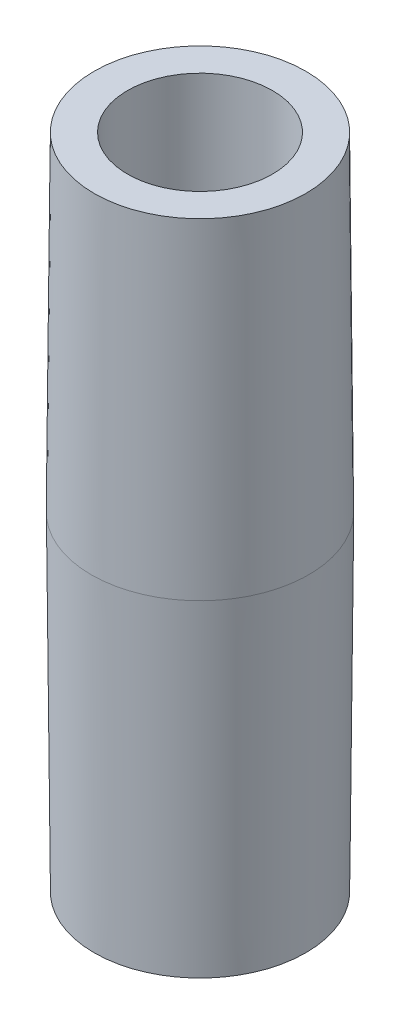
ISO-10303-21;
HEADER;
FILE_DESCRIPTION(('STEP AP214'),'2;1');
FILE_NAME('part.step','',(''),(''),'','','');
FILE_SCHEMA(('AUTOMOTIVE_DESIGN { 1 0 10303 214 1 1 1 1 }'));
ENDSEC;
DATA;
#1=APPLICATION_CONTEXT('core data for automotive mechanical design processes');
#2=APPLICATION_PROTOCOL_DEFINITION('international standard','automotive_design',2000,#1);
#3=PRODUCT_CONTEXT('',#1,'mechanical');
#4=PRODUCT('Part','Part','',(#3));
#5=PRODUCT_RELATED_PRODUCT_CATEGORY('part','',(#4));
#6=PRODUCT_DEFINITION_FORMATION('','',#4);
#7=PRODUCT_DEFINITION_CONTEXT('part definition',#1,'design');
#8=PRODUCT_DEFINITION('design','',#6,#7);
#9=PRODUCT_DEFINITION_SHAPE('','',#8);
#10=(LENGTH_UNIT() NAMED_UNIT(*) SI_UNIT(.MILLI.,.METRE.));
#11=(NAMED_UNIT(*) PLANE_ANGLE_UNIT() SI_UNIT($,.RADIAN.));
#12=(NAMED_UNIT(*) SI_UNIT($,.STERADIAN.) SOLID_ANGLE_UNIT());
#13=UNCERTAINTY_MEASURE_WITH_UNIT(LENGTH_MEASURE(1.E-05),#10,'distance_accuracy_value','');
#14=(GEOMETRIC_REPRESENTATION_CONTEXT(3) GLOBAL_UNCERTAINTY_ASSIGNED_CONTEXT((#13)) GLOBAL_UNIT_ASSIGNED_CONTEXT((#10,
#11,#12)) REPRESENTATION_CONTEXT('',''));
#15=CARTESIAN_POINT('',(0.,0.,0.));
#16=DIRECTION('',(0.,0.,1.));
#17=DIRECTION('',(1.,0.,0.));
#18=AXIS2_PLACEMENT_3D('',#15,#16,#17);
#19=CARTESIAN_POINT('',(0.,-1.13686837721616E-10,0.));
#20=DIRECTION('',(0.,1.,0.));
#21=DIRECTION('',(0.,0.,1.));
#22=AXIS2_PLACEMENT_3D('',#19,#20,#21);
#23=CONICAL_SURFACE('',#22,3.14999999999976,0.0087266462600229);
#24=CARTESIAN_POINT('',(0.,0.,0.));
#25=DIRECTION('',(0.,-1.,0.));
#26=DIRECTION('',(0.,0.,1.));
#27=AXIS2_PLACEMENT_3D('',#24,#25,#26);
#28=CIRCLE('',#27,3.15000000000065);
#29=CARTESIAN_POINT('',(0.,0.,3.15000000000065));
#30=VERTEX_POINT('',#29);
#31=EDGE_CURVE('E29',#30,#30,#28,.F.);
#32=ORIENTED_EDGE('',*,*,#31,.F.);
#33=EDGE_LOOP('',(#32));
#34=FACE_BOUND('',#33,.T.);
#35=CARTESIAN_POINT('',(0.,-9.52499999999645,0.));
#36=DIRECTION('',(0.,1.,0.));
#37=DIRECTION('',(0.,0.,1.));
#38=AXIS2_PLACEMENT_3D('',#35,#36,#37);
#39=CIRCLE('',#38,3.06687658429332);
#40=CARTESIAN_POINT('',(0.,-9.52499999999645,3.06687658429332));
#41=VERTEX_POINT('',#40);
#42=EDGE_CURVE('E17',#41,#41,#39,.T.);
#43=ORIENTED_EDGE('',*,*,#42,.T.);
#44=EDGE_LOOP('',(#43));
#45=FACE_BOUND('',#44,.T.);
#46=ADVANCED_FACE('F14',(#34,#45),#23,.T.);
#47=CARTESIAN_POINT('',(0.,1.13686837721616E-10,0.));
#48=DIRECTION('',(0.,-1.,0.));
#49=DIRECTION('',(0.,0.,-1.));
#50=AXIS2_PLACEMENT_3D('',#47,#48,#49);
#51=CONICAL_SURFACE('',#50,3.14999999999976,0.0087266462600229);
#52=ORIENTED_EDGE('',*,*,#31,.T.);
#53=EDGE_LOOP('',(#52));
#54=FACE_BOUND('',#53,.T.);
#55=CARTESIAN_POINT('',(0.,9.52499999999645,0.));
#56=DIRECTION('',(0.,-1.,0.));
#57=DIRECTION('',(0.,0.,-1.));
#58=AXIS2_PLACEMENT_3D('',#55,#56,#57);
#59=CIRCLE('',#58,3.06687658429332);
#60=CARTESIAN_POINT('',(0.,9.52499999999645,-3.06687658429332));
#61=VERTEX_POINT('',#60);
#62=EDGE_CURVE('E26',#61,#61,#59,.F.);
#63=ORIENTED_EDGE('',*,*,#62,.F.);
#64=EDGE_LOOP('',(#63));
#65=FACE_BOUND('',#64,.T.);
#66=ADVANCED_FACE('F39',(#54,#65),#51,.T.);
#67=CARTESIAN_POINT('',(0.,-9.525,0.));
#68=DIRECTION('',(0.,1.,0.));
#69=DIRECTION('',(0.,0.,1.));
#70=AXIS2_PLACEMENT_3D('',#67,#68,#69);
#71=PLANE('',#70);
#72=CARTESIAN_POINT('',(0.,-9.525,0.));
#73=DIRECTION('',(0.,-1.,0.));
#74=DIRECTION('',(0.,0.,-1.));
#75=AXIS2_PLACEMENT_3D('',#72,#73,#74);
#76=CIRCLE('',#75,2.1);
#77=CARTESIAN_POINT('',(0.,-9.525,-2.1));
#78=VERTEX_POINT('',#77);
#79=EDGE_CURVE('E21',#78,#78,#76,.F.);
#80=ORIENTED_EDGE('',*,*,#79,.T.);
#81=EDGE_LOOP('',(#80));
#82=FACE_BOUND('',#81,.T.);
#83=ORIENTED_EDGE('',*,*,#42,.F.);
#84=EDGE_LOOP('',(#83));
#85=FACE_BOUND('',#84,.T.);
#86=ADVANCED_FACE('F47',(#82,#85),#71,.F.);
#87=CARTESIAN_POINT('',(0.,9.525,0.));
#88=DIRECTION('',(0.,1.,0.));
#89=DIRECTION('',(0.,0.,1.));
#90=AXIS2_PLACEMENT_3D('',#87,#88,#89);
#91=PLANE('',#90);
#92=CARTESIAN_POINT('',(0.,9.525,0.));
#93=DIRECTION('',(0.,-1.,0.));
#94=DIRECTION('',(0.,0.,-1.));
#95=AXIS2_PLACEMENT_3D('',#92,#93,#94);
#96=CIRCLE('',#95,2.1);
#97=CARTESIAN_POINT('',(0.,9.525,-2.1));
#98=VERTEX_POINT('',#97);
#99=EDGE_CURVE('E10',#98,#98,#96,.T.);
#100=ORIENTED_EDGE('',*,*,#99,.T.);
#101=EDGE_LOOP('',(#100));
#102=FACE_BOUND('',#101,.T.);
#103=ORIENTED_EDGE('',*,*,#62,.T.);
#104=EDGE_LOOP('',(#103));
#105=FACE_BOUND('',#104,.T.);
#106=ADVANCED_FACE('F50',(#102,#105),#91,.T.);
#107=CARTESIAN_POINT('',(0.,9.525,0.));
#108=DIRECTION('',(0.,-1.,0.));
#109=DIRECTION('',(0.,0.,-1.));
#110=AXIS2_PLACEMENT_3D('',#107,#108,#109);
#111=CYLINDRICAL_SURFACE('',#110,2.1);
#112=ORIENTED_EDGE('',*,*,#79,.F.);
#113=EDGE_LOOP('',(#112));
#114=FACE_BOUND('',#113,.T.);
#115=ORIENTED_EDGE('',*,*,#99,.F.);
#116=EDGE_LOOP('',(#115));
#117=FACE_BOUND('',#116,.T.);
#118=ADVANCED_FACE('F48',(#114,#117),#111,.F.);
#119=CLOSED_SHELL('',(#46,#66,#86,#106,#118));
#120=MANIFOLD_SOLID_BREP('B1',#119);
#121=ADVANCED_BREP_SHAPE_REPRESENTATION('',(#18,#120),#14);
#122=SHAPE_DEFINITION_REPRESENTATION(#9,#121);
ENDSEC;
END-ISO-10303-21;
